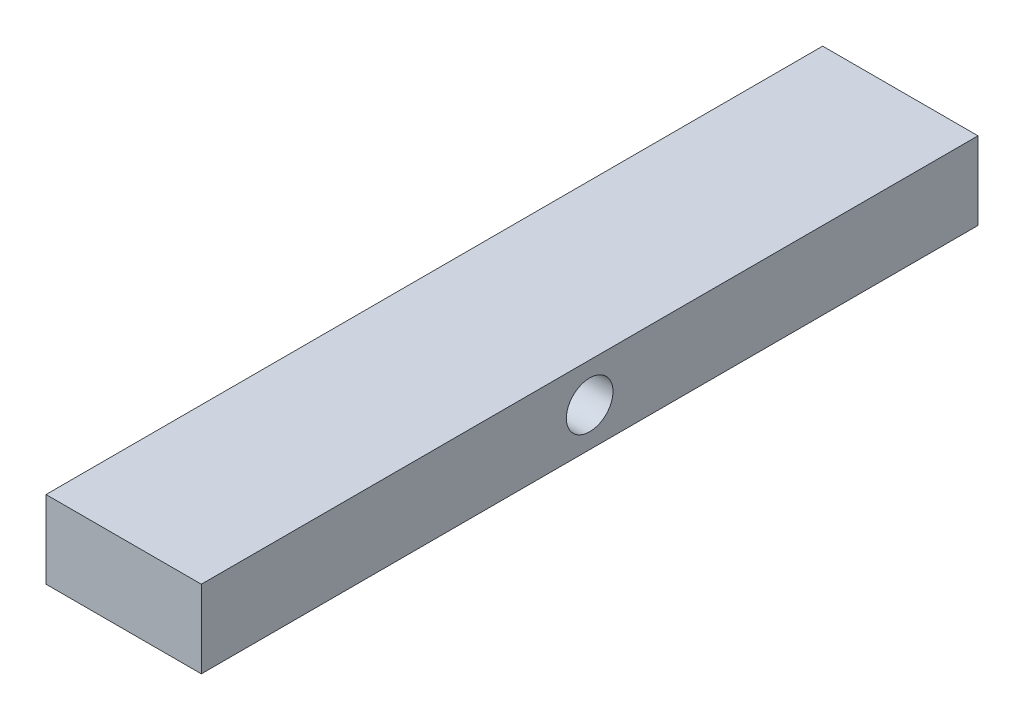
ISO-10303-21;
HEADER;
FILE_DESCRIPTION(('STEP AP214'),'2;1');
FILE_NAME('part.step','',(''),(''),'','','');
FILE_SCHEMA(('AUTOMOTIVE_DESIGN { 1 0 10303 214 1 1 1 1 }'));
ENDSEC;
DATA;
#1=APPLICATION_CONTEXT('core data for automotive mechanical design processes');
#2=APPLICATION_PROTOCOL_DEFINITION('international standard','automotive_design',2000,#1);
#3=PRODUCT_CONTEXT('',#1,'mechanical');
#4=PRODUCT('Part','Part','',(#3));
#5=PRODUCT_RELATED_PRODUCT_CATEGORY('part','',(#4));
#6=PRODUCT_DEFINITION_FORMATION('','',#4);
#7=PRODUCT_DEFINITION_CONTEXT('part definition',#1,'design');
#8=PRODUCT_DEFINITION('design','',#6,#7);
#9=PRODUCT_DEFINITION_SHAPE('','',#8);
#10=(LENGTH_UNIT() NAMED_UNIT(*) SI_UNIT(.MILLI.,.METRE.));
#11=(NAMED_UNIT(*) PLANE_ANGLE_UNIT() SI_UNIT($,.RADIAN.));
#12=(NAMED_UNIT(*) SI_UNIT($,.STERADIAN.) SOLID_ANGLE_UNIT());
#13=UNCERTAINTY_MEASURE_WITH_UNIT(LENGTH_MEASURE(1.E-05),#10,'distance_accuracy_value','');
#14=(GEOMETRIC_REPRESENTATION_CONTEXT(3) GLOBAL_UNCERTAINTY_ASSIGNED_CONTEXT((#13)) GLOBAL_UNIT_ASSIGNED_CONTEXT((#10,
#11,#12)) REPRESENTATION_CONTEXT('',''));
#15=CARTESIAN_POINT('',(0.,0.,0.));
#16=DIRECTION('',(0.,0.,1.));
#17=DIRECTION('',(1.,0.,0.));
#18=AXIS2_PLACEMENT_3D('',#15,#16,#17);
#19=CARTESIAN_POINT('',(50.,25.,500.));
#20=DIRECTION('',(-1.,0.,0.));
#21=DIRECTION('',(0.,0.,1.));
#22=AXIS2_PLACEMENT_3D('',#19,#20,#21);
#23=PLANE('',#22);
#24=CARTESIAN_POINT('',(50.,0.,250.));
#25=DIRECTION('',(1.,0.,0.));
#26=DIRECTION('',(0.,0.,-1.));
#27=AXIS2_PLACEMENT_3D('',#24,#25,#26);
#28=CIRCLE('',#27,15.);
#29=CARTESIAN_POINT('',(50.,0.,235.));
#30=VERTEX_POINT('',#29);
#31=EDGE_CURVE('E112',#30,#30,#28,.T.);
#32=ORIENTED_EDGE('',*,*,#31,.F.);
#33=EDGE_LOOP('',(#32));
#34=FACE_BOUND('',#33,.T.);
#35=DIRECTION('',(0.,1.,0.));
#36=VECTOR('',#35,1.);
#37=CARTESIAN_POINT('',(50.,25.,0.));
#38=LINE('',#37,#36);
#39=CARTESIAN_POINT('',(50.,-25.,0.));
#40=VERTEX_POINT('',#39);
#41=CARTESIAN_POINT('',(50.,25.,0.));
#42=VERTEX_POINT('',#41);
#43=EDGE_CURVE('E98',#40,#42,#38,.T.);
#44=ORIENTED_EDGE('',*,*,#43,.T.);
#45=DIRECTION('',(0.,0.,-1.));
#46=VECTOR('',#45,1.);
#47=CARTESIAN_POINT('',(50.,25.,500.));
#48=LINE('',#47,#46);
#49=CARTESIAN_POINT('',(50.,25.,500.));
#50=VERTEX_POINT('',#49);
#51=EDGE_CURVE('E11',#50,#42,#48,.T.);
#52=ORIENTED_EDGE('',*,*,#51,.F.);
#53=DIRECTION('',(0.,1.,0.));
#54=VECTOR('',#53,1.);
#55=CARTESIAN_POINT('',(50.,25.,500.));
#56=LINE('',#55,#54);
#57=CARTESIAN_POINT('',(50.,-25.,500.));
#58=VERTEX_POINT('',#57);
#59=EDGE_CURVE('E86',#58,#50,#56,.T.);
#60=ORIENTED_EDGE('',*,*,#59,.F.);
#61=DIRECTION('',(0.,0.,-1.));
#62=VECTOR('',#61,1.);
#63=CARTESIAN_POINT('',(50.,-25.,500.));
#64=LINE('',#63,#62);
#65=EDGE_CURVE('E94',#58,#40,#64,.T.);
#66=ORIENTED_EDGE('',*,*,#65,.T.);
#67=EDGE_LOOP('',(#44,#52,#60,#66));
#68=FACE_BOUND('',#67,.T.);
#69=ADVANCED_FACE('F35',(#34,#68),#23,.F.);
#70=CARTESIAN_POINT('',(-50.,25.,500.));
#71=DIRECTION('',(0.,-1.,0.));
#72=DIRECTION('',(0.,0.,-1.));
#73=AXIS2_PLACEMENT_3D('',#70,#71,#72);
#74=PLANE('',#73);
#75=DIRECTION('',(-1.,0.,0.));
#76=VECTOR('',#75,1.);
#77=CARTESIAN_POINT('',(-50.,25.,0.));
#78=LINE('',#77,#76);
#79=CARTESIAN_POINT('',(-50.,25.,0.));
#80=VERTEX_POINT('',#79);
#81=EDGE_CURVE('E90',#42,#80,#78,.T.);
#82=ORIENTED_EDGE('',*,*,#81,.T.);
#83=DIRECTION('',(0.,0.,-1.));
#84=VECTOR('',#83,1.);
#85=CARTESIAN_POINT('',(-50.,25.,500.));
#86=LINE('',#85,#84);
#87=CARTESIAN_POINT('',(-50.,25.,500.));
#88=VERTEX_POINT('',#87);
#89=EDGE_CURVE('E43',#88,#80,#86,.T.);
#90=ORIENTED_EDGE('',*,*,#89,.F.);
#91=DIRECTION('',(-1.,0.,0.));
#92=VECTOR('',#91,1.);
#93=CARTESIAN_POINT('',(-50.,25.,500.));
#94=LINE('',#93,#92);
#95=EDGE_CURVE('E81',#50,#88,#94,.T.);
#96=ORIENTED_EDGE('',*,*,#95,.F.);
#97=ORIENTED_EDGE('',*,*,#51,.T.);
#98=EDGE_LOOP('',(#82,#90,#96,#97));
#99=FACE_BOUND('',#98,.T.);
#100=ADVANCED_FACE('F89',(#99),#74,.F.);
#101=CARTESIAN_POINT('',(-50.,25.,500.));
#102=DIRECTION('',(1.,0.,0.));
#103=DIRECTION('',(0.,0.,-1.));
#104=AXIS2_PLACEMENT_3D('',#101,#102,#103);
#105=PLANE('',#104);
#106=CARTESIAN_POINT('',(-50.,0.,250.));
#107=DIRECTION('',(1.,0.,0.));
#108=DIRECTION('',(0.,0.,-1.));
#109=AXIS2_PLACEMENT_3D('',#106,#107,#108);
#110=CIRCLE('',#109,15.);
#111=CARTESIAN_POINT('',(-50.,0.,235.));
#112=VERTEX_POINT('',#111);
#113=EDGE_CURVE('E101',#112,#112,#110,.T.);
#114=ORIENTED_EDGE('',*,*,#113,.T.);
#115=EDGE_LOOP('',(#114));
#116=FACE_BOUND('',#115,.T.);
#117=DIRECTION('',(0.,-1.,0.));
#118=VECTOR('',#117,1.);
#119=CARTESIAN_POINT('',(-50.,25.,0.));
#120=LINE('',#119,#118);
#121=CARTESIAN_POINT('',(-50.,-25.,0.));
#122=VERTEX_POINT('',#121);
#123=EDGE_CURVE('E68',#80,#122,#120,.T.);
#124=ORIENTED_EDGE('',*,*,#123,.T.);
#125=DIRECTION('',(0.,0.,-1.));
#126=VECTOR('',#125,1.);
#127=CARTESIAN_POINT('',(-50.,-25.,500.));
#128=LINE('',#127,#126);
#129=CARTESIAN_POINT('',(-50.,-25.,500.));
#130=VERTEX_POINT('',#129);
#131=EDGE_CURVE('E91',#130,#122,#128,.T.);
#132=ORIENTED_EDGE('',*,*,#131,.F.);
#133=DIRECTION('',(0.,-1.,0.));
#134=VECTOR('',#133,1.);
#135=CARTESIAN_POINT('',(-50.,25.,500.));
#136=LINE('',#135,#134);
#137=EDGE_CURVE('E84',#88,#130,#136,.T.);
#138=ORIENTED_EDGE('',*,*,#137,.F.);
#139=ORIENTED_EDGE('',*,*,#89,.T.);
#140=EDGE_LOOP('',(#124,#132,#138,#139));
#141=FACE_BOUND('',#140,.T.);
#142=ADVANCED_FACE('F92',(#116,#141),#105,.F.);
#143=CARTESIAN_POINT('',(-50.,-25.,500.));
#144=DIRECTION('',(0.,1.,0.));
#145=DIRECTION('',(0.,0.,1.));
#146=AXIS2_PLACEMENT_3D('',#143,#144,#145);
#147=PLANE('',#146);
#148=DIRECTION('',(1.,0.,0.));
#149=VECTOR('',#148,1.);
#150=CARTESIAN_POINT('',(-50.,-25.,0.));
#151=LINE('',#150,#149);
#152=EDGE_CURVE('E74',#122,#40,#151,.T.);
#153=ORIENTED_EDGE('',*,*,#152,.T.);
#154=ORIENTED_EDGE('',*,*,#65,.F.);
#155=DIRECTION('',(1.,0.,0.));
#156=VECTOR('',#155,1.);
#157=CARTESIAN_POINT('',(-50.,-25.,500.));
#158=LINE('',#157,#156);
#159=EDGE_CURVE('E51',#130,#58,#158,.T.);
#160=ORIENTED_EDGE('',*,*,#159,.F.);
#161=ORIENTED_EDGE('',*,*,#131,.T.);
#162=EDGE_LOOP('',(#153,#154,#160,#161));
#163=FACE_BOUND('',#162,.T.);
#164=ADVANCED_FACE('F106',(#163),#147,.F.);
#165=CARTESIAN_POINT('',(0.,0.,500.));
#166=DIRECTION('',(0.,0.,1.));
#167=DIRECTION('',(1.,0.,0.));
#168=AXIS2_PLACEMENT_3D('',#165,#166,#167);
#169=PLANE('',#168);
#170=ORIENTED_EDGE('',*,*,#59,.T.);
#171=ORIENTED_EDGE('',*,*,#95,.T.);
#172=ORIENTED_EDGE('',*,*,#137,.T.);
#173=ORIENTED_EDGE('',*,*,#159,.T.);
#174=EDGE_LOOP('',(#170,#171,#172,#173));
#175=FACE_BOUND('',#174,.T.);
#176=ADVANCED_FACE('F82',(#175),#169,.T.);
#177=CARTESIAN_POINT('',(0.,0.,0.));
#178=DIRECTION('',(0.,0.,1.));
#179=DIRECTION('',(1.,0.,0.));
#180=AXIS2_PLACEMENT_3D('',#177,#178,#179);
#181=PLANE('',#180);
#182=ORIENTED_EDGE('',*,*,#43,.F.);
#183=ORIENTED_EDGE('',*,*,#152,.F.);
#184=ORIENTED_EDGE('',*,*,#123,.F.);
#185=ORIENTED_EDGE('',*,*,#81,.F.);
#186=EDGE_LOOP('',(#182,#183,#184,#185));
#187=FACE_BOUND('',#186,.T.);
#188=ADVANCED_FACE('F109',(#187),#181,.F.);
#189=CARTESIAN_POINT('',(-50.,0.,250.));
#190=DIRECTION('',(1.,0.,0.));
#191=DIRECTION('',(0.,0.,-1.));
#192=AXIS2_PLACEMENT_3D('',#189,#190,#191);
#193=CYLINDRICAL_SURFACE('',#192,15.);
#194=ORIENTED_EDGE('',*,*,#113,.F.);
#195=EDGE_LOOP('',(#194));
#196=FACE_BOUND('',#195,.T.);
#197=ORIENTED_EDGE('',*,*,#31,.T.);
#198=EDGE_LOOP('',(#197));
#199=FACE_BOUND('',#198,.T.);
#200=ADVANCED_FACE('F119',(#196,#199),#193,.F.);
#201=CLOSED_SHELL('',(#69,#100,#142,#164,#176,#188,#200));
#202=MANIFOLD_SOLID_BREP('B2',#201);
#203=ADVANCED_BREP_SHAPE_REPRESENTATION('',(#18,#202),#14);
#204=SHAPE_DEFINITION_REPRESENTATION(#9,#203);
ENDSEC;
END-ISO-10303-21;
